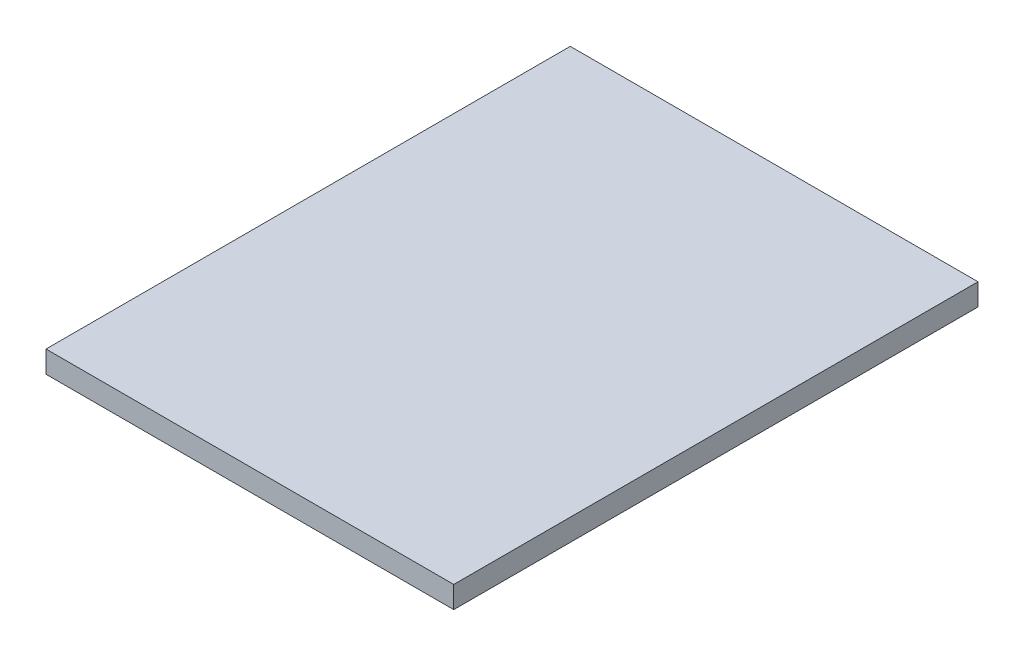
ISO-10303-21;
HEADER;
FILE_DESCRIPTION(('STEP AP214'),'2;1');
FILE_NAME('part.step','',(''),(''),'','','');
FILE_SCHEMA(('AUTOMOTIVE_DESIGN { 1 0 10303 214 1 1 1 1 }'));
ENDSEC;
DATA;
#1=APPLICATION_CONTEXT('core data for automotive mechanical design processes');
#2=APPLICATION_PROTOCOL_DEFINITION('international standard','automotive_design',2000,#1);
#3=PRODUCT_CONTEXT('',#1,'mechanical');
#4=PRODUCT('Part','Part','',(#3));
#5=PRODUCT_RELATED_PRODUCT_CATEGORY('part','',(#4));
#6=PRODUCT_DEFINITION_FORMATION('','',#4);
#7=PRODUCT_DEFINITION_CONTEXT('part definition',#1,'design');
#8=PRODUCT_DEFINITION('design','',#6,#7);
#9=PRODUCT_DEFINITION_SHAPE('','',#8);
#10=(LENGTH_UNIT() NAMED_UNIT(*) SI_UNIT(.MILLI.,.METRE.));
#11=(NAMED_UNIT(*) PLANE_ANGLE_UNIT() SI_UNIT($,.RADIAN.));
#12=(NAMED_UNIT(*) SI_UNIT($,.STERADIAN.) SOLID_ANGLE_UNIT());
#13=UNCERTAINTY_MEASURE_WITH_UNIT(LENGTH_MEASURE(1.E-05),#10,'distance_accuracy_value','');
#14=(GEOMETRIC_REPRESENTATION_CONTEXT(3) GLOBAL_UNCERTAINTY_ASSIGNED_CONTEXT((#13)) GLOBAL_UNIT_ASSIGNED_CONTEXT((#10,
#11,#12)) REPRESENTATION_CONTEXT('',''));
#15=CARTESIAN_POINT('',(0.,0.,0.));
#16=DIRECTION('',(0.,0.,1.));
#17=DIRECTION('',(1.,0.,0.));
#18=AXIS2_PLACEMENT_3D('',#15,#16,#17);
#19=CARTESIAN_POINT('',(88.8999999999999,9.525,-114.3));
#20=DIRECTION('',(-1.,0.,0.));
#21=DIRECTION('',(0.,0.,1.));
#22=AXIS2_PLACEMENT_3D('',#19,#20,#21);
#23=PLANE('',#22);
#24=DIRECTION('',(0.,0.,-1.));
#25=VECTOR('',#24,1.);
#26=CARTESIAN_POINT('',(88.8999999999999,0.,-114.3));
#27=LINE('',#26,#25);
#28=CARTESIAN_POINT('',(88.9,0.,114.3));
#29=VERTEX_POINT('',#28);
#30=CARTESIAN_POINT('',(88.8999999999999,0.,-114.3));
#31=VERTEX_POINT('',#30);
#32=EDGE_CURVE('E111',#29,#31,#27,.T.);
#33=ORIENTED_EDGE('',*,*,#32,.T.);
#34=DIRECTION('',(0.,-1.,0.));
#35=VECTOR('',#34,1.);
#36=CARTESIAN_POINT('',(88.8999999999999,9.525,-114.3));
#37=LINE('',#36,#35);
#38=CARTESIAN_POINT('',(88.8999999999999,9.525,-114.3));
#39=VERTEX_POINT('',#38);
#40=EDGE_CURVE('E11',#39,#31,#37,.T.);
#41=ORIENTED_EDGE('',*,*,#40,.F.);
#42=DIRECTION('',(0.,0.,-1.));
#43=VECTOR('',#42,1.);
#44=CARTESIAN_POINT('',(88.8999999999999,9.525,-114.3));
#45=LINE('',#44,#43);
#46=CARTESIAN_POINT('',(88.9,9.525,114.3));
#47=VERTEX_POINT('',#46);
#48=EDGE_CURVE('E95',#47,#39,#45,.T.);
#49=ORIENTED_EDGE('',*,*,#48,.F.);
#50=DIRECTION('',(0.,-1.,0.));
#51=VECTOR('',#50,1.);
#52=CARTESIAN_POINT('',(88.9,9.525,114.3));
#53=LINE('',#52,#51);
#54=EDGE_CURVE('E107',#47,#29,#53,.T.);
#55=ORIENTED_EDGE('',*,*,#54,.T.);
#56=EDGE_LOOP('',(#33,#41,#49,#55));
#57=FACE_BOUND('',#56,.T.);
#58=ADVANCED_FACE('F43',(#57),#23,.F.);
#59=CARTESIAN_POINT('',(-88.9,9.525,-114.3));
#60=DIRECTION('',(0.,0.,1.));
#61=DIRECTION('',(1.,0.,0.));
#62=AXIS2_PLACEMENT_3D('',#59,#60,#61);
#63=PLANE('',#62);
#64=DIRECTION('',(-1.,0.,0.));
#65=VECTOR('',#64,1.);
#66=CARTESIAN_POINT('',(-88.9,0.,-114.3));
#67=LINE('',#66,#65);
#68=CARTESIAN_POINT('',(-88.9,0.,-114.3));
#69=VERTEX_POINT('',#68);
#70=EDGE_CURVE('E100',#31,#69,#67,.T.);
#71=ORIENTED_EDGE('',*,*,#70,.T.);
#72=DIRECTION('',(0.,-1.,0.));
#73=VECTOR('',#72,1.);
#74=CARTESIAN_POINT('',(-88.9,9.525,-114.3));
#75=LINE('',#74,#73);
#76=CARTESIAN_POINT('',(-88.9,9.525,-114.3));
#77=VERTEX_POINT('',#76);
#78=EDGE_CURVE('E52',#77,#69,#75,.T.);
#79=ORIENTED_EDGE('',*,*,#78,.F.);
#80=DIRECTION('',(-1.,0.,0.));
#81=VECTOR('',#80,1.);
#82=CARTESIAN_POINT('',(-88.9,9.525,-114.3));
#83=LINE('',#82,#81);
#84=EDGE_CURVE('E90',#39,#77,#83,.T.);
#85=ORIENTED_EDGE('',*,*,#84,.F.);
#86=ORIENTED_EDGE('',*,*,#40,.T.);
#87=EDGE_LOOP('',(#71,#79,#85,#86));
#88=FACE_BOUND('',#87,.T.);
#89=ADVANCED_FACE('F99',(#88),#63,.F.);
#90=CARTESIAN_POINT('',(-88.9,9.525,-114.3));
#91=DIRECTION('',(1.,0.,0.));
#92=DIRECTION('',(0.,0.,-1.));
#93=AXIS2_PLACEMENT_3D('',#90,#91,#92);
#94=PLANE('',#93);
#95=DIRECTION('',(0.,0.,1.));
#96=VECTOR('',#95,1.);
#97=CARTESIAN_POINT('',(-88.9,0.,-114.3));
#98=LINE('',#97,#96);
#99=CARTESIAN_POINT('',(-88.9,0.,114.3));
#100=VERTEX_POINT('',#99);
#101=EDGE_CURVE('E77',#69,#100,#98,.T.);
#102=ORIENTED_EDGE('',*,*,#101,.T.);
#103=DIRECTION('',(0.,-1.,0.));
#104=VECTOR('',#103,1.);
#105=CARTESIAN_POINT('',(-88.9,9.525,114.3));
#106=LINE('',#105,#104);
#107=CARTESIAN_POINT('',(-88.9,9.525,114.3));
#108=VERTEX_POINT('',#107);
#109=EDGE_CURVE('E102',#108,#100,#106,.T.);
#110=ORIENTED_EDGE('',*,*,#109,.F.);
#111=DIRECTION('',(0.,0.,1.));
#112=VECTOR('',#111,1.);
#113=CARTESIAN_POINT('',(-88.9,9.525,-114.3));
#114=LINE('',#113,#112);
#115=EDGE_CURVE('E93',#77,#108,#114,.T.);
#116=ORIENTED_EDGE('',*,*,#115,.F.);
#117=ORIENTED_EDGE('',*,*,#78,.T.);
#118=EDGE_LOOP('',(#102,#110,#116,#117));
#119=FACE_BOUND('',#118,.T.);
#120=ADVANCED_FACE('F103',(#119),#94,.F.);
#121=CARTESIAN_POINT('',(-88.9,9.525,114.3));
#122=DIRECTION('',(0.,0.,-1.));
#123=DIRECTION('',(-1.,0.,0.));
#124=AXIS2_PLACEMENT_3D('',#121,#122,#123);
#125=PLANE('',#124);
#126=DIRECTION('',(1.,0.,0.));
#127=VECTOR('',#126,1.);
#128=CARTESIAN_POINT('',(-88.9,0.,114.3));
#129=LINE('',#128,#127);
#130=EDGE_CURVE('E83',#100,#29,#129,.T.);
#131=ORIENTED_EDGE('',*,*,#130,.T.);
#132=ORIENTED_EDGE('',*,*,#54,.F.);
#133=DIRECTION('',(1.,0.,0.));
#134=VECTOR('',#133,1.);
#135=CARTESIAN_POINT('',(-88.9,9.525,114.3));
#136=LINE('',#135,#134);
#137=EDGE_CURVE('E60',#108,#47,#136,.T.);
#138=ORIENTED_EDGE('',*,*,#137,.F.);
#139=ORIENTED_EDGE('',*,*,#109,.T.);
#140=EDGE_LOOP('',(#131,#132,#138,#139));
#141=FACE_BOUND('',#140,.T.);
#142=ADVANCED_FACE('F124',(#141),#125,.F.);
#143=CARTESIAN_POINT('',(0.,9.525,0.));
#144=DIRECTION('',(0.,1.,0.));
#145=DIRECTION('',(0.,0.,1.));
#146=AXIS2_PLACEMENT_3D('',#143,#144,#145);
#147=PLANE('',#146);
#148=ORIENTED_EDGE('',*,*,#48,.T.);
#149=ORIENTED_EDGE('',*,*,#84,.T.);
#150=ORIENTED_EDGE('',*,*,#115,.T.);
#151=ORIENTED_EDGE('',*,*,#137,.T.);
#152=EDGE_LOOP('',(#148,#149,#150,#151));
#153=FACE_BOUND('',#152,.T.);
#154=ADVANCED_FACE('F91',(#153),#147,.T.);
#155=CARTESIAN_POINT('',(0.,0.,0.));
#156=DIRECTION('',(0.,1.,0.));
#157=DIRECTION('',(0.,0.,1.));
#158=AXIS2_PLACEMENT_3D('',#155,#156,#157);
#159=PLANE('',#158);
#160=ORIENTED_EDGE('',*,*,#32,.F.);
#161=ORIENTED_EDGE('',*,*,#130,.F.);
#162=ORIENTED_EDGE('',*,*,#101,.F.);
#163=ORIENTED_EDGE('',*,*,#70,.F.);
#164=EDGE_LOOP('',(#160,#161,#162,#163));
#165=FACE_BOUND('',#164,.T.);
#166=ADVANCED_FACE('F127',(#165),#159,.F.);
#167=CLOSED_SHELL('',(#58,#89,#120,#142,#154,#166));
#168=MANIFOLD_SOLID_BREP('B2',#167);
#169=ADVANCED_BREP_SHAPE_REPRESENTATION('',(#18,#168),#14);
#170=SHAPE_DEFINITION_REPRESENTATION(#9,#169);
ENDSEC;
END-ISO-10303-21;
